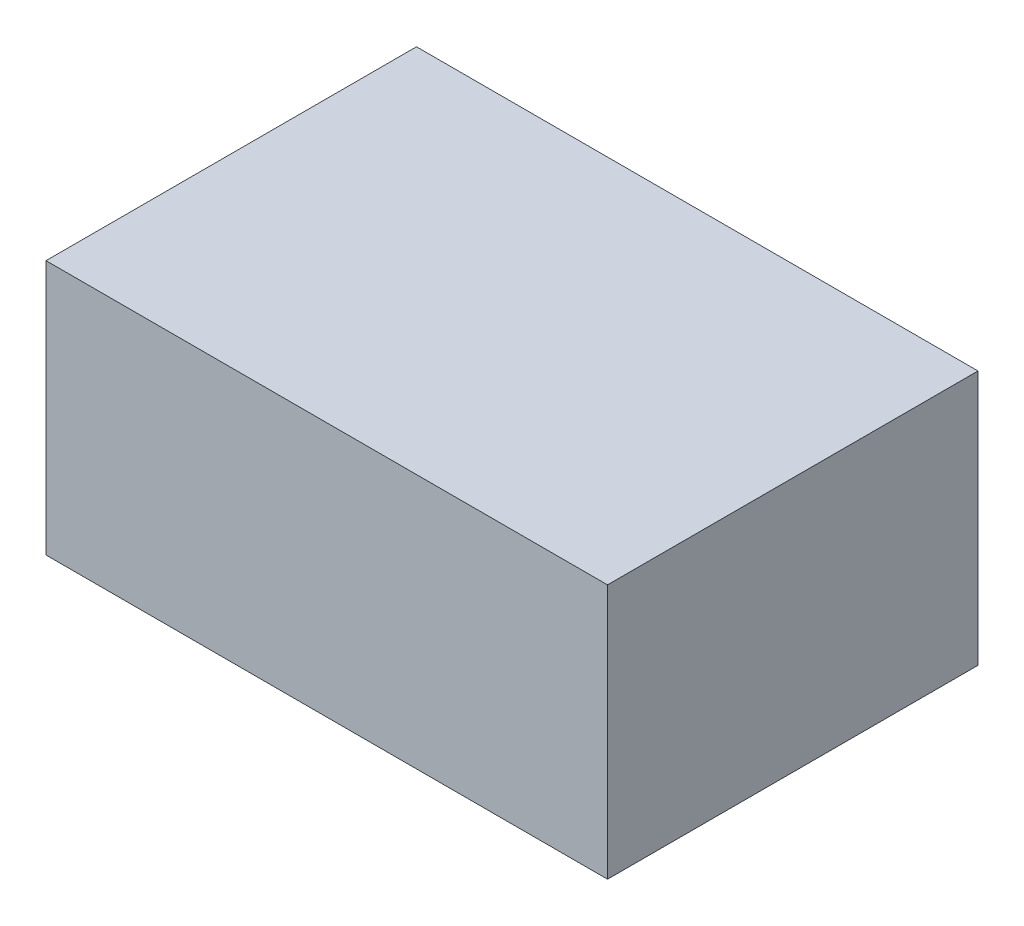
ISO-10303-21;
HEADER;
FILE_DESCRIPTION(('STEP AP214'),'2;1');
FILE_NAME('part.step','',(''),(''),'','','');
FILE_SCHEMA(('AUTOMOTIVE_DESIGN { 1 0 10303 214 1 1 1 1 }'));
ENDSEC;
DATA;
#1=APPLICATION_CONTEXT('core data for automotive mechanical design processes');
#2=APPLICATION_PROTOCOL_DEFINITION('international standard','automotive_design',2000,#1);
#3=PRODUCT_CONTEXT('',#1,'mechanical');
#4=PRODUCT('Part','Part','',(#3));
#5=PRODUCT_RELATED_PRODUCT_CATEGORY('part','',(#4));
#6=PRODUCT_DEFINITION_FORMATION('','',#4);
#7=PRODUCT_DEFINITION_CONTEXT('part definition',#1,'design');
#8=PRODUCT_DEFINITION('design','',#6,#7);
#9=PRODUCT_DEFINITION_SHAPE('','',#8);
#10=(LENGTH_UNIT() NAMED_UNIT(*) SI_UNIT(.MILLI.,.METRE.));
#11=(NAMED_UNIT(*) PLANE_ANGLE_UNIT() SI_UNIT($,.RADIAN.));
#12=(NAMED_UNIT(*) SI_UNIT($,.STERADIAN.) SOLID_ANGLE_UNIT());
#13=UNCERTAINTY_MEASURE_WITH_UNIT(LENGTH_MEASURE(1.E-05),#10,'distance_accuracy_value','');
#14=(GEOMETRIC_REPRESENTATION_CONTEXT(3) GLOBAL_UNCERTAINTY_ASSIGNED_CONTEXT((#13)) GLOBAL_UNIT_ASSIGNED_CONTEXT((#10,
#11,#12)) REPRESENTATION_CONTEXT('',''));
#15=CARTESIAN_POINT('',(0.,0.,0.));
#16=DIRECTION('',(0.,0.,1.));
#17=DIRECTION('',(1.,0.,0.));
#18=AXIS2_PLACEMENT_3D('',#15,#16,#17);
#19=CARTESIAN_POINT('',(493.482459860901,72.1439264750679,-153.182809740031));
#20=DIRECTION('',(-1.,0.,0.));
#21=DIRECTION('',(0.,-1.,0.));
#22=AXIS2_PLACEMENT_3D('',#19,#20,#21);
#23=PLANE('',#22);
#24=DIRECTION('',(0.,0.,1.));
#25=VECTOR('',#24,1.);
#26=CARTESIAN_POINT('',(493.482459860901,94.8439264750679,-153.182809740031));
#27=LINE('',#26,#25);
#28=CARTESIAN_POINT('',(493.482459860901,94.8439264750679,-186.170978982754));
#29=VERTEX_POINT('',#28);
#30=CARTESIAN_POINT('',(493.482459860901,94.8439264750679,-153.182809740031));
#31=VERTEX_POINT('',#30);
#32=EDGE_CURVE('E96',#29,#31,#27,.T.);
#33=ORIENTED_EDGE('',*,*,#32,.T.);
#34=DIRECTION('',(0.,1.,0.));
#35=VECTOR('',#34,1.);
#36=CARTESIAN_POINT('',(493.482459860901,72.1439264750679,-153.182809740031));
#37=LINE('',#36,#35);
#38=CARTESIAN_POINT('',(493.482459860901,72.1439264750679,-153.182809740031));
#39=VERTEX_POINT('',#38);
#40=EDGE_CURVE('E11',#39,#31,#37,.T.);
#41=ORIENTED_EDGE('',*,*,#40,.F.);
#42=DIRECTION('',(0.,0.,1.));
#43=VECTOR('',#42,1.);
#44=CARTESIAN_POINT('',(493.482459860901,72.1439264750679,-153.182809740031));
#45=LINE('',#44,#43);
#46=CARTESIAN_POINT('',(493.482459860901,72.1439264750679,-186.170978982754));
#47=VERTEX_POINT('',#46);
#48=EDGE_CURVE('E84',#47,#39,#45,.T.);
#49=ORIENTED_EDGE('',*,*,#48,.F.);
#50=DIRECTION('',(0.,1.,0.));
#51=VECTOR('',#50,1.);
#52=CARTESIAN_POINT('',(493.482459860901,72.1439264750679,-186.170978982754));
#53=LINE('',#52,#51);
#54=EDGE_CURVE('E92',#47,#29,#53,.T.);
#55=ORIENTED_EDGE('',*,*,#54,.T.);
#56=EDGE_LOOP('',(#33,#41,#49,#55));
#57=FACE_BOUND('',#56,.T.);
#58=ADVANCED_FACE('F33',(#57),#23,.F.);
#59=CARTESIAN_POINT('',(443.482459860901,72.1439264750679,-153.182809740031));
#60=DIRECTION('',(0.,0.,-1.));
#61=DIRECTION('',(0.,1.,0.));
#62=AXIS2_PLACEMENT_3D('',#59,#60,#61);
#63=PLANE('',#62);
#64=DIRECTION('',(-1.,0.,0.));
#65=VECTOR('',#64,1.);
#66=CARTESIAN_POINT('',(443.482459860901,94.8439264750679,-153.182809740031));
#67=LINE('',#66,#65);
#68=CARTESIAN_POINT('',(443.482459860901,94.8439264750679,-153.182809740031));
#69=VERTEX_POINT('',#68);
#70=EDGE_CURVE('E88',#31,#69,#67,.T.);
#71=ORIENTED_EDGE('',*,*,#70,.T.);
#72=DIRECTION('',(0.,1.,0.));
#73=VECTOR('',#72,1.);
#74=CARTESIAN_POINT('',(443.482459860901,72.1439264750679,-153.182809740031));
#75=LINE('',#74,#73);
#76=CARTESIAN_POINT('',(443.482459860901,72.1439264750679,-153.182809740031));
#77=VERTEX_POINT('',#76);
#78=EDGE_CURVE('E41',#77,#69,#75,.T.);
#79=ORIENTED_EDGE('',*,*,#78,.F.);
#80=DIRECTION('',(-1.,0.,0.));
#81=VECTOR('',#80,1.);
#82=CARTESIAN_POINT('',(443.482459860901,72.1439264750679,-153.182809740031));
#83=LINE('',#82,#81);
#84=EDGE_CURVE('E79',#39,#77,#83,.T.);
#85=ORIENTED_EDGE('',*,*,#84,.F.);
#86=ORIENTED_EDGE('',*,*,#40,.T.);
#87=EDGE_LOOP('',(#71,#79,#85,#86));
#88=FACE_BOUND('',#87,.T.);
#89=ADVANCED_FACE('F87',(#88),#63,.F.);
#90=CARTESIAN_POINT('',(443.482459860901,72.1439264750679,-153.182809740031));
#91=DIRECTION('',(1.,0.,0.));
#92=DIRECTION('',(0.,1.,0.));
#93=AXIS2_PLACEMENT_3D('',#90,#91,#92);
#94=PLANE('',#93);
#95=DIRECTION('',(0.,0.,-1.));
#96=VECTOR('',#95,1.);
#97=CARTESIAN_POINT('',(443.482459860901,94.8439264750679,-153.182809740031));
#98=LINE('',#97,#96);
#99=CARTESIAN_POINT('',(443.482459860901,94.8439264750679,-186.170978982754));
#100=VERTEX_POINT('',#99);
#101=EDGE_CURVE('E66',#69,#100,#98,.T.);
#102=ORIENTED_EDGE('',*,*,#101,.T.);
#103=DIRECTION('',(0.,1.,0.));
#104=VECTOR('',#103,1.);
#105=CARTESIAN_POINT('',(443.482459860901,72.1439264750679,-186.170978982754));
#106=LINE('',#105,#104);
#107=CARTESIAN_POINT('',(443.482459860901,72.1439264750679,-186.170978982754));
#108=VERTEX_POINT('',#107);
#109=EDGE_CURVE('E89',#108,#100,#106,.T.);
#110=ORIENTED_EDGE('',*,*,#109,.F.);
#111=DIRECTION('',(0.,0.,-1.));
#112=VECTOR('',#111,1.);
#113=CARTESIAN_POINT('',(443.482459860901,72.1439264750679,-153.182809740031));
#114=LINE('',#113,#112);
#115=EDGE_CURVE('E82',#77,#108,#114,.T.);
#116=ORIENTED_EDGE('',*,*,#115,.F.);
#117=ORIENTED_EDGE('',*,*,#78,.T.);
#118=EDGE_LOOP('',(#102,#110,#116,#117));
#119=FACE_BOUND('',#118,.T.);
#120=ADVANCED_FACE('F90',(#119),#94,.F.);
#121=CARTESIAN_POINT('',(443.482459860901,72.1439264750679,-186.170978982754));
#122=DIRECTION('',(0.,0.,1.));
#123=DIRECTION('',(0.,-1.,0.));
#124=AXIS2_PLACEMENT_3D('',#121,#122,#123);
#125=PLANE('',#124);
#126=DIRECTION('',(1.,0.,0.));
#127=VECTOR('',#126,1.);
#128=CARTESIAN_POINT('',(443.482459860901,94.8439264750679,-186.170978982754));
#129=LINE('',#128,#127);
#130=EDGE_CURVE('E72',#100,#29,#129,.T.);
#131=ORIENTED_EDGE('',*,*,#130,.T.);
#132=ORIENTED_EDGE('',*,*,#54,.F.);
#133=DIRECTION('',(1.,0.,0.));
#134=VECTOR('',#133,1.);
#135=CARTESIAN_POINT('',(443.482459860901,72.1439264750679,-186.170978982754));
#136=LINE('',#135,#134);
#137=EDGE_CURVE('E49',#108,#47,#136,.T.);
#138=ORIENTED_EDGE('',*,*,#137,.F.);
#139=ORIENTED_EDGE('',*,*,#109,.T.);
#140=EDGE_LOOP('',(#131,#132,#138,#139));
#141=FACE_BOUND('',#140,.T.);
#142=ADVANCED_FACE('F103',(#141),#125,.F.);
#143=CARTESIAN_POINT('',(0.,72.1439264750679,0.));
#144=DIRECTION('',(0.,-1.,0.));
#145=DIRECTION('',(0.,0.,-1.));
#146=AXIS2_PLACEMENT_3D('',#143,#144,#145);
#147=PLANE('',#146);
#148=ORIENTED_EDGE('',*,*,#48,.T.);
#149=ORIENTED_EDGE('',*,*,#84,.T.);
#150=ORIENTED_EDGE('',*,*,#115,.T.);
#151=ORIENTED_EDGE('',*,*,#137,.T.);
#152=EDGE_LOOP('',(#148,#149,#150,#151));
#153=FACE_BOUND('',#152,.T.);
#154=ADVANCED_FACE('F80',(#153),#147,.T.);
#155=CARTESIAN_POINT('',(0.,94.8439264750679,0.));
#156=DIRECTION('',(0.,-1.,0.));
#157=DIRECTION('',(0.,0.,-1.));
#158=AXIS2_PLACEMENT_3D('',#155,#156,#157);
#159=PLANE('',#158);
#160=ORIENTED_EDGE('',*,*,#32,.F.);
#161=ORIENTED_EDGE('',*,*,#130,.F.);
#162=ORIENTED_EDGE('',*,*,#101,.F.);
#163=ORIENTED_EDGE('',*,*,#70,.F.);
#164=EDGE_LOOP('',(#160,#161,#162,#163));
#165=FACE_BOUND('',#164,.T.);
#166=ADVANCED_FACE('F106',(#165),#159,.F.);
#167=CLOSED_SHELL('',(#58,#89,#120,#142,#154,#166));
#168=MANIFOLD_SOLID_BREP('B2',#167);
#169=ADVANCED_BREP_SHAPE_REPRESENTATION('',(#18,#168),#14);
#170=SHAPE_DEFINITION_REPRESENTATION(#9,#169);
ENDSEC;
END-ISO-10303-21;
